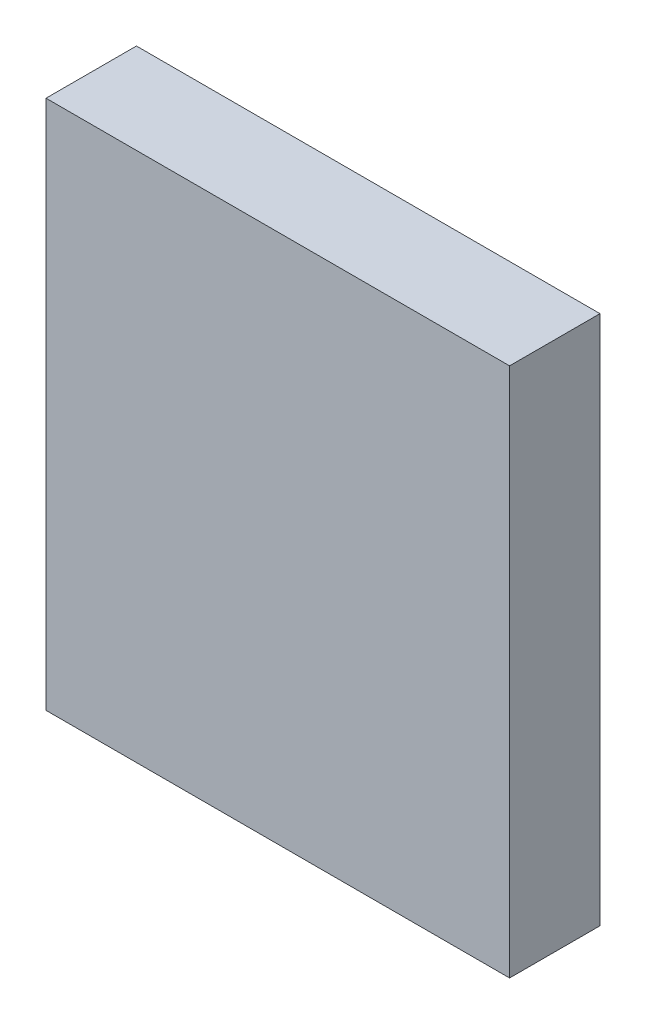
ISO-10303-21;
HEADER;
FILE_DESCRIPTION(('STEP AP214'),'2;1');
FILE_NAME('part.step','',(''),(''),'','','');
FILE_SCHEMA(('AUTOMOTIVE_DESIGN { 1 0 10303 214 1 1 1 1 }'));
ENDSEC;
DATA;
#1=APPLICATION_CONTEXT('core data for automotive mechanical design processes');
#2=APPLICATION_PROTOCOL_DEFINITION('international standard','automotive_design',2000,#1);
#3=PRODUCT_CONTEXT('',#1,'mechanical');
#4=PRODUCT('Part','Part','',(#3));
#5=PRODUCT_RELATED_PRODUCT_CATEGORY('part','',(#4));
#6=PRODUCT_DEFINITION_FORMATION('','',#4);
#7=PRODUCT_DEFINITION_CONTEXT('part definition',#1,'design');
#8=PRODUCT_DEFINITION('design','',#6,#7);
#9=PRODUCT_DEFINITION_SHAPE('','',#8);
#10=(LENGTH_UNIT() NAMED_UNIT(*) SI_UNIT(.MILLI.,.METRE.));
#11=(NAMED_UNIT(*) PLANE_ANGLE_UNIT() SI_UNIT($,.RADIAN.));
#12=(NAMED_UNIT(*) SI_UNIT($,.STERADIAN.) SOLID_ANGLE_UNIT());
#13=UNCERTAINTY_MEASURE_WITH_UNIT(LENGTH_MEASURE(1.E-05),#10,'distance_accuracy_value','');
#14=(GEOMETRIC_REPRESENTATION_CONTEXT(3) GLOBAL_UNCERTAINTY_ASSIGNED_CONTEXT((#13)) GLOBAL_UNIT_ASSIGNED_CONTEXT((#10,
#11,#12)) REPRESENTATION_CONTEXT('',''));
#15=CARTESIAN_POINT('',(0.,0.,0.));
#16=DIRECTION('',(0.,0.,1.));
#17=DIRECTION('',(1.,0.,0.));
#18=AXIS2_PLACEMENT_3D('',#15,#16,#17);
#19=CARTESIAN_POINT('',(0.,0.,1.));
#20=DIRECTION('',(0.,0.,1.));
#21=DIRECTION('',(1.,0.,0.));
#22=AXIS2_PLACEMENT_3D('',#19,#20,#21);
#23=PLANE('',#22);
#24=DIRECTION('',(1.,0.,0.));
#25=VECTOR('',#24,1.);
#26=CARTESIAN_POINT('',(2.5635,3.3,1.));
#27=LINE('',#26,#25);
#28=CARTESIAN_POINT('',(-2.5635,3.3,1.));
#29=VERTEX_POINT('',#28);
#30=CARTESIAN_POINT('',(2.5635,3.3,1.));
#31=VERTEX_POINT('',#30);
#32=EDGE_CURVE('E68',#29,#31,#27,.T.);
#33=ORIENTED_EDGE('',*,*,#32,.F.);
#34=DIRECTION('',(0.,1.,0.));
#35=VECTOR('',#34,1.);
#36=CARTESIAN_POINT('',(-2.5635,3.3,1.));
#37=LINE('',#36,#35);
#38=CARTESIAN_POINT('',(-2.5635,-2.5635,1.));
#39=VERTEX_POINT('',#38);
#40=EDGE_CURVE('E20',#39,#29,#37,.T.);
#41=ORIENTED_EDGE('',*,*,#40,.F.);
#42=DIRECTION('',(1.,0.,0.));
#43=VECTOR('',#42,1.);
#44=CARTESIAN_POINT('',(-2.5635,-2.5635,1.));
#45=LINE('',#44,#43);
#46=CARTESIAN_POINT('',(2.5635,-2.5635,1.));
#47=VERTEX_POINT('',#46);
#48=EDGE_CURVE('E58',#47,#39,#45,.F.);
#49=ORIENTED_EDGE('',*,*,#48,.F.);
#50=DIRECTION('',(0.,1.,0.));
#51=VECTOR('',#50,1.);
#52=CARTESIAN_POINT('',(2.5635,-2.5635,1.));
#53=LINE('',#52,#51);
#54=EDGE_CURVE('E53',#31,#47,#53,.F.);
#55=ORIENTED_EDGE('',*,*,#54,.F.);
#56=EDGE_LOOP('',(#33,#41,#49,#55));
#57=FACE_BOUND('',#56,.T.);
#58=ADVANCED_FACE('F17',(#57),#23,.T.);
#59=CARTESIAN_POINT('',(-2.5635,3.3,0.));
#60=DIRECTION('',(-1.,0.,0.));
#61=DIRECTION('',(0.,0.,1.));
#62=AXIS2_PLACEMENT_3D('',#59,#60,#61);
#63=PLANE('',#62);
#64=DIRECTION('',(0.,0.,1.));
#65=VECTOR('',#64,1.);
#66=CARTESIAN_POINT('',(-2.5635,3.3,0.));
#67=LINE('',#66,#65);
#68=CARTESIAN_POINT('',(-2.5635,3.3,0.));
#69=VERTEX_POINT('',#68);
#70=EDGE_CURVE('E79',#69,#29,#67,.T.);
#71=ORIENTED_EDGE('',*,*,#70,.F.);
#72=DIRECTION('',(0.,1.,0.));
#73=VECTOR('',#72,1.);
#74=CARTESIAN_POINT('',(-2.5635,0.,0.));
#75=LINE('',#74,#73);
#76=CARTESIAN_POINT('',(-2.5635,-2.5635,0.));
#77=VERTEX_POINT('',#76);
#78=EDGE_CURVE('E74',#69,#77,#75,.F.);
#79=ORIENTED_EDGE('',*,*,#78,.T.);
#80=DIRECTION('',(0.,0.,-1.));
#81=VECTOR('',#80,1.);
#82=CARTESIAN_POINT('',(-2.5635,-2.5635,0.));
#83=LINE('',#82,#81);
#84=EDGE_CURVE('E63',#39,#77,#83,.T.);
#85=ORIENTED_EDGE('',*,*,#84,.F.);
#86=ORIENTED_EDGE('',*,*,#40,.T.);
#87=EDGE_LOOP('',(#71,#79,#85,#86));
#88=FACE_BOUND('',#87,.T.);
#89=ADVANCED_FACE('F73',(#88),#63,.T.);
#90=CARTESIAN_POINT('',(-2.5635,-2.5635,0.));
#91=DIRECTION('',(0.,-1.,0.));
#92=DIRECTION('',(0.,0.,-1.));
#93=AXIS2_PLACEMENT_3D('',#90,#91,#92);
#94=PLANE('',#93);
#95=ORIENTED_EDGE('',*,*,#84,.T.);
#96=DIRECTION('',(1.,0.,0.));
#97=VECTOR('',#96,1.);
#98=CARTESIAN_POINT('',(0.,-2.5635,0.));
#99=LINE('',#98,#97);
#100=CARTESIAN_POINT('',(2.5635,-2.5635,0.));
#101=VERTEX_POINT('',#100);
#102=EDGE_CURVE('E84',#77,#101,#99,.T.);
#103=ORIENTED_EDGE('',*,*,#102,.T.);
#104=DIRECTION('',(0.,0.,-1.));
#105=VECTOR('',#104,1.);
#106=CARTESIAN_POINT('',(2.5635,-2.5635,0.));
#107=LINE('',#106,#105);
#108=EDGE_CURVE('E65',#47,#101,#107,.T.);
#109=ORIENTED_EDGE('',*,*,#108,.F.);
#110=ORIENTED_EDGE('',*,*,#48,.T.);
#111=EDGE_LOOP('',(#95,#103,#109,#110));
#112=FACE_BOUND('',#111,.T.);
#113=ADVANCED_FACE('F60',(#112),#94,.T.);
#114=CARTESIAN_POINT('',(2.5635,-2.5635,0.));
#115=DIRECTION('',(1.,0.,0.));
#116=DIRECTION('',(0.,0.,-1.));
#117=AXIS2_PLACEMENT_3D('',#114,#115,#116);
#118=PLANE('',#117);
#119=ORIENTED_EDGE('',*,*,#108,.T.);
#120=DIRECTION('',(0.,1.,0.));
#121=VECTOR('',#120,1.);
#122=CARTESIAN_POINT('',(2.5635,0.,0.));
#123=LINE('',#122,#121);
#124=CARTESIAN_POINT('',(2.5635,3.3,0.));
#125=VERTEX_POINT('',#124);
#126=EDGE_CURVE('E26',#101,#125,#123,.T.);
#127=ORIENTED_EDGE('',*,*,#126,.T.);
#128=DIRECTION('',(0.,0.,1.));
#129=VECTOR('',#128,1.);
#130=CARTESIAN_POINT('',(2.5635,3.3,0.));
#131=LINE('',#130,#129);
#132=EDGE_CURVE('E34',#31,#125,#131,.F.);
#133=ORIENTED_EDGE('',*,*,#132,.F.);
#134=ORIENTED_EDGE('',*,*,#54,.T.);
#135=EDGE_LOOP('',(#119,#127,#133,#134));
#136=FACE_BOUND('',#135,.T.);
#137=ADVANCED_FACE('F88',(#136),#118,.T.);
#138=CARTESIAN_POINT('',(2.5635,3.3,0.));
#139=DIRECTION('',(0.,1.,0.));
#140=DIRECTION('',(0.,0.,1.));
#141=AXIS2_PLACEMENT_3D('',#138,#139,#140);
#142=PLANE('',#141);
#143=ORIENTED_EDGE('',*,*,#132,.T.);
#144=DIRECTION('',(1.,0.,0.));
#145=VECTOR('',#144,1.);
#146=CARTESIAN_POINT('',(0.,3.3,0.));
#147=LINE('',#146,#145);
#148=EDGE_CURVE('E11',#125,#69,#147,.F.);
#149=ORIENTED_EDGE('',*,*,#148,.T.);
#150=ORIENTED_EDGE('',*,*,#70,.T.);
#151=ORIENTED_EDGE('',*,*,#32,.T.);
#152=EDGE_LOOP('',(#143,#149,#150,#151));
#153=FACE_BOUND('',#152,.T.);
#154=ADVANCED_FACE('F91',(#153),#142,.T.);
#155=CARTESIAN_POINT('',(0.,0.,0.));
#156=DIRECTION('',(0.,0.,1.));
#157=DIRECTION('',(1.,0.,0.));
#158=AXIS2_PLACEMENT_3D('',#155,#156,#157);
#159=PLANE('',#158);
#160=ORIENTED_EDGE('',*,*,#126,.F.);
#161=ORIENTED_EDGE('',*,*,#102,.F.);
#162=ORIENTED_EDGE('',*,*,#78,.F.);
#163=ORIENTED_EDGE('',*,*,#148,.F.);
#164=EDGE_LOOP('',(#160,#161,#162,#163));
#165=FACE_BOUND('',#164,.T.);
#166=ADVANCED_FACE('F90',(#165),#159,.F.);
#167=CLOSED_SHELL('',(#58,#89,#113,#137,#154,#166));
#168=MANIFOLD_SOLID_BREP('B1',#167);
#169=ADVANCED_BREP_SHAPE_REPRESENTATION('',(#18,#168),#14);
#170=SHAPE_DEFINITION_REPRESENTATION(#9,#169);
ENDSEC;
END-ISO-10303-21;
